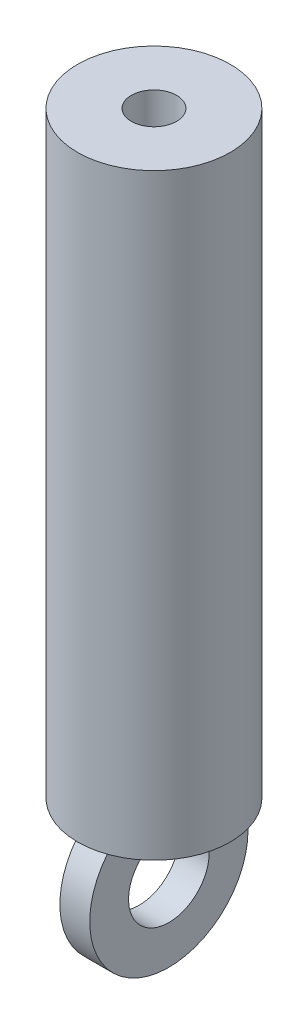
ISO-10303-21;
HEADER;
FILE_DESCRIPTION(('STEP AP214'),'2;1');
FILE_NAME('part.step','',(''),(''),'','','');
FILE_SCHEMA(('AUTOMOTIVE_DESIGN { 1 0 10303 214 1 1 1 1 }'));
ENDSEC;
DATA;
#1=APPLICATION_CONTEXT('core data for automotive mechanical design processes');
#2=APPLICATION_PROTOCOL_DEFINITION('international standard','automotive_design',2000,#1);
#3=PRODUCT_CONTEXT('',#1,'mechanical');
#4=PRODUCT('Part','Part','',(#3));
#5=PRODUCT_RELATED_PRODUCT_CATEGORY('part','',(#4));
#6=PRODUCT_DEFINITION_FORMATION('','',#4);
#7=PRODUCT_DEFINITION_CONTEXT('part definition',#1,'design');
#8=PRODUCT_DEFINITION('design','',#6,#7);
#9=PRODUCT_DEFINITION_SHAPE('','',#8);
#10=(LENGTH_UNIT() NAMED_UNIT(*) SI_UNIT(.MILLI.,.METRE.));
#11=(NAMED_UNIT(*) PLANE_ANGLE_UNIT() SI_UNIT($,.RADIAN.));
#12=(NAMED_UNIT(*) SI_UNIT($,.STERADIAN.) SOLID_ANGLE_UNIT());
#13=UNCERTAINTY_MEASURE_WITH_UNIT(LENGTH_MEASURE(1.E-05),#10,'distance_accuracy_value','');
#14=(GEOMETRIC_REPRESENTATION_CONTEXT(3) GLOBAL_UNCERTAINTY_ASSIGNED_CONTEXT((#13)) GLOBAL_UNIT_ASSIGNED_CONTEXT((#10,
#11,#12)) REPRESENTATION_CONTEXT('',''));
#15=CARTESIAN_POINT('',(0.,0.,0.));
#16=DIRECTION('',(0.,0.,1.));
#17=DIRECTION('',(1.,0.,0.));
#18=AXIS2_PLACEMENT_3D('',#15,#16,#17);
#19=CARTESIAN_POINT('',(0.889,-2.31140000000001,0.));
#20=DIRECTION('',(1.,0.,0.));
#21=DIRECTION('',(0.,0.,-1.));
#22=AXIS2_PLACEMENT_3D('',#19,#20,#21);
#23=PLANE('',#22);
#24=CARTESIAN_POINT('',(0.889,-2.31140000000001,0.));
#25=DIRECTION('',(1.,0.,0.));
#26=DIRECTION('',(0.,0.,-1.));
#27=AXIS2_PLACEMENT_3D('',#24,#25,#26);
#28=CIRCLE('',#27,4.7117);
#29=CARTESIAN_POINT('',(0.889,-2.31140000000001,-4.7117));
#30=VERTEX_POINT('',#29);
#31=EDGE_CURVE('E11',#30,#30,#28,.T.);
#32=ORIENTED_EDGE('',*,*,#31,.T.);
#33=EDGE_LOOP('',(#32));
#34=FACE_BOUND('',#33,.T.);
#35=CARTESIAN_POINT('',(0.889,-2.31140000000001,0.));
#36=DIRECTION('',(1.,0.,0.));
#37=DIRECTION('',(0.,0.,-1.));
#38=AXIS2_PLACEMENT_3D('',#35,#36,#37);
#39=CIRCLE('',#38,2.4003);
#40=CARTESIAN_POINT('',(0.889,-2.31140000000001,-2.4003));
#41=VERTEX_POINT('',#40);
#42=EDGE_CURVE('E52',#41,#41,#39,.T.);
#43=ORIENTED_EDGE('',*,*,#42,.F.);
#44=EDGE_LOOP('',(#43));
#45=FACE_BOUND('',#44,.T.);
#46=ADVANCED_FACE('F41',(#34,#45),#23,.T.);
#47=CARTESIAN_POINT('',(-0.889,-2.31140000000001,0.));
#48=DIRECTION('',(1.,0.,0.));
#49=DIRECTION('',(0.,0.,-1.));
#50=AXIS2_PLACEMENT_3D('',#47,#48,#49);
#51=PLANE('',#50);
#52=CARTESIAN_POINT('',(-0.889,-2.31140000000001,0.));
#53=DIRECTION('',(1.,0.,0.));
#54=DIRECTION('',(0.,0.,-1.));
#55=AXIS2_PLACEMENT_3D('',#52,#53,#54);
#56=CIRCLE('',#55,4.7117);
#57=CARTESIAN_POINT('',(-0.889,-2.31140000000001,-4.7117));
#58=VERTEX_POINT('',#57);
#59=EDGE_CURVE('E45',#58,#58,#56,.T.);
#60=ORIENTED_EDGE('',*,*,#59,.F.);
#61=EDGE_LOOP('',(#60));
#62=FACE_BOUND('',#61,.T.);
#63=CARTESIAN_POINT('',(-0.889,-2.31140000000001,0.));
#64=DIRECTION('',(1.,0.,0.));
#65=DIRECTION('',(0.,0.,-1.));
#66=AXIS2_PLACEMENT_3D('',#63,#64,#65);
#67=CIRCLE('',#66,2.4003);
#68=CARTESIAN_POINT('',(-0.889,-2.31140000000001,-2.4003));
#69=VERTEX_POINT('',#68);
#70=EDGE_CURVE('E54',#69,#69,#67,.T.);
#71=ORIENTED_EDGE('',*,*,#70,.T.);
#72=EDGE_LOOP('',(#71));
#73=FACE_BOUND('',#72,.T.);
#74=ADVANCED_FACE('F64',(#62,#73),#51,.F.);
#75=CARTESIAN_POINT('',(0.889,-2.31140000000001,0.));
#76=DIRECTION('',(-1.,0.,0.));
#77=DIRECTION('',(0.,0.,1.));
#78=AXIS2_PLACEMENT_3D('',#75,#76,#77);
#79=CYLINDRICAL_SURFACE('',#78,4.7117);
#80=ORIENTED_EDGE('',*,*,#31,.F.);
#81=EDGE_LOOP('',(#80));
#82=FACE_BOUND('',#81,.T.);
#83=ORIENTED_EDGE('',*,*,#59,.T.);
#84=EDGE_LOOP('',(#83));
#85=FACE_BOUND('',#84,.T.);
#86=ADVANCED_FACE('F43',(#82,#85),#79,.T.);
#87=CARTESIAN_POINT('',(0.889,-2.31140000000001,0.));
#88=DIRECTION('',(-1.,0.,0.));
#89=DIRECTION('',(0.,0.,1.));
#90=AXIS2_PLACEMENT_3D('',#87,#88,#89);
#91=CYLINDRICAL_SURFACE('',#90,2.4003);
#92=ORIENTED_EDGE('',*,*,#42,.T.);
#93=EDGE_LOOP('',(#92));
#94=FACE_BOUND('',#93,.T.);
#95=ORIENTED_EDGE('',*,*,#70,.F.);
#96=EDGE_LOOP('',(#95));
#97=FACE_BOUND('',#96,.T.);
#98=ADVANCED_FACE('F60',(#94,#97),#91,.F.);
#99=CLOSED_SHELL('',(#46,#74,#86,#98));
#100=MANIFOLD_SOLID_BREP('B2',#99);
#101=CARTESIAN_POINT('',(0.,36.83,0.));
#102=DIRECTION('',(0.,1.,0.));
#103=DIRECTION('',(0.,0.,1.));
#104=AXIS2_PLACEMENT_3D('',#101,#102,#103);
#105=PLANE('',#104);
#106=CARTESIAN_POINT('',(0.,36.83,0.));
#107=DIRECTION('',(0.,1.,0.));
#108=DIRECTION('',(0.,0.,1.));
#109=AXIS2_PLACEMENT_3D('',#106,#107,#108);
#110=CIRCLE('',#109,4.5466);
#111=CARTESIAN_POINT('',(0.,36.83,4.5466));
#112=VERTEX_POINT('',#111);
#113=EDGE_CURVE('E40',#112,#112,#110,.T.);
#114=ORIENTED_EDGE('',*,*,#113,.T.);
#115=EDGE_LOOP('',(#114));
#116=FACE_BOUND('',#115,.T.);
#117=CARTESIAN_POINT('',(0.,36.83,0.));
#118=DIRECTION('',(0.,1.,0.));
#119=DIRECTION('',(0.,0.,1.));
#120=AXIS2_PLACEMENT_3D('',#117,#118,#119);
#121=CIRCLE('',#120,1.3462);
#122=CARTESIAN_POINT('',(0.,36.83,1.3462));
#123=VERTEX_POINT('',#122);
#124=EDGE_CURVE('E114',#123,#123,#121,.T.);
#125=ORIENTED_EDGE('',*,*,#124,.F.);
#126=EDGE_LOOP('',(#125));
#127=FACE_BOUND('',#126,.T.);
#128=ADVANCED_FACE('F103',(#116,#127),#105,.T.);
#129=CARTESIAN_POINT('',(0.,1.27,0.));
#130=DIRECTION('',(0.,1.,0.));
#131=DIRECTION('',(0.,0.,1.));
#132=AXIS2_PLACEMENT_3D('',#129,#130,#131);
#133=PLANE('',#132);
#134=CARTESIAN_POINT('',(0.,1.27,0.));
#135=DIRECTION('',(0.,1.,0.));
#136=DIRECTION('',(0.,0.,1.));
#137=AXIS2_PLACEMENT_3D('',#134,#135,#136);
#138=CIRCLE('',#137,4.5466);
#139=CARTESIAN_POINT('',(0.,1.27,4.5466));
#140=VERTEX_POINT('',#139);
#141=EDGE_CURVE('E107',#140,#140,#138,.T.);
#142=ORIENTED_EDGE('',*,*,#141,.F.);
#143=EDGE_LOOP('',(#142));
#144=FACE_BOUND('',#143,.T.);
#145=CARTESIAN_POINT('',(0.,1.27,0.));
#146=DIRECTION('',(0.,1.,0.));
#147=DIRECTION('',(0.,0.,1.));
#148=AXIS2_PLACEMENT_3D('',#145,#146,#147);
#149=CIRCLE('',#148,1.3462);
#150=CARTESIAN_POINT('',(0.,1.27,1.3462));
#151=VERTEX_POINT('',#150);
#152=EDGE_CURVE('E116',#151,#151,#149,.T.);
#153=ORIENTED_EDGE('',*,*,#152,.T.);
#154=EDGE_LOOP('',(#153));
#155=FACE_BOUND('',#154,.T.);
#156=ADVANCED_FACE('F126',(#144,#155),#133,.F.);
#157=CARTESIAN_POINT('',(0.,36.83,0.));
#158=DIRECTION('',(0.,-1.,0.));
#159=DIRECTION('',(0.,0.,-1.));
#160=AXIS2_PLACEMENT_3D('',#157,#158,#159);
#161=CYLINDRICAL_SURFACE('',#160,4.5466);
#162=ORIENTED_EDGE('',*,*,#113,.F.);
#163=EDGE_LOOP('',(#162));
#164=FACE_BOUND('',#163,.T.);
#165=ORIENTED_EDGE('',*,*,#141,.T.);
#166=EDGE_LOOP('',(#165));
#167=FACE_BOUND('',#166,.T.);
#168=ADVANCED_FACE('F105',(#164,#167),#161,.T.);
#169=CARTESIAN_POINT('',(0.,36.83,0.));
#170=DIRECTION('',(0.,-1.,0.));
#171=DIRECTION('',(0.,0.,-1.));
#172=AXIS2_PLACEMENT_3D('',#169,#170,#171);
#173=CYLINDRICAL_SURFACE('',#172,1.3462);
#174=ORIENTED_EDGE('',*,*,#124,.T.);
#175=EDGE_LOOP('',(#174));
#176=FACE_BOUND('',#175,.T.);
#177=ORIENTED_EDGE('',*,*,#152,.F.);
#178=EDGE_LOOP('',(#177));
#179=FACE_BOUND('',#178,.T.);
#180=ADVANCED_FACE('F122',(#176,#179),#173,.F.);
#181=CLOSED_SHELL('',(#128,#156,#168,#180));
#182=MANIFOLD_SOLID_BREP('B6',#181);
#183=ADVANCED_BREP_SHAPE_REPRESENTATION('',(#18,#100,#182),#14);
#184=SHAPE_DEFINITION_REPRESENTATION(#9,#183);
ENDSEC;
END-ISO-10303-21;
